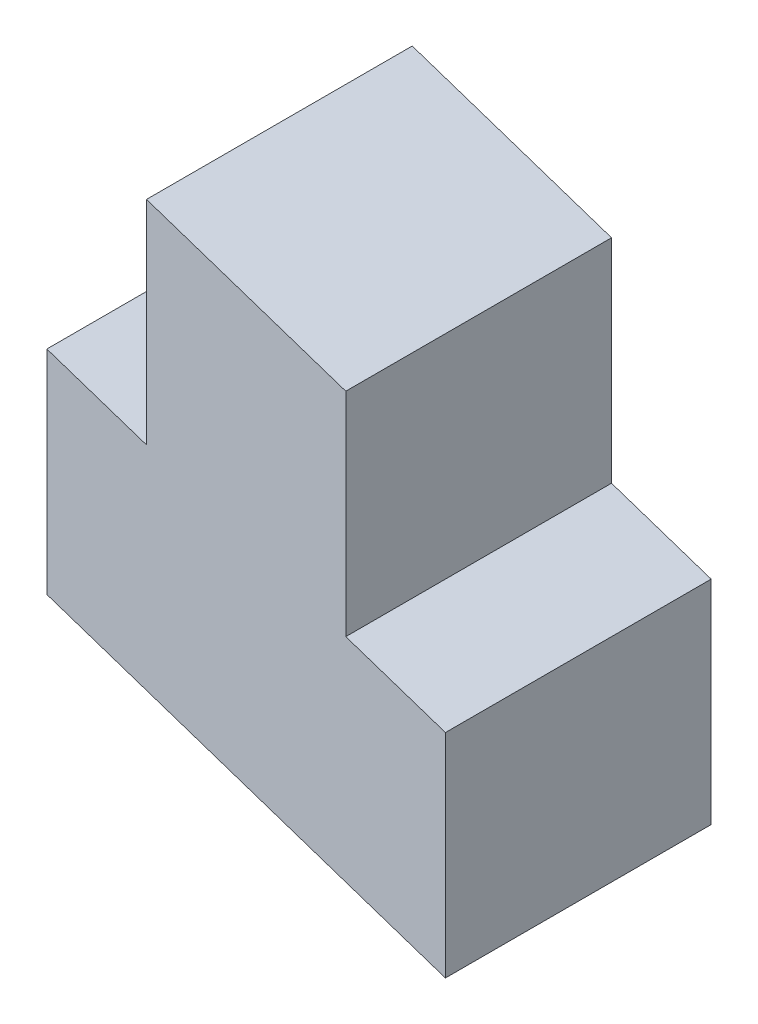
ISO-10303-21;
HEADER;
FILE_DESCRIPTION(('STEP AP214'),'2;1');
FILE_NAME('part.step','',(''),(''),'','','');
FILE_SCHEMA(('AUTOMOTIVE_DESIGN { 1 0 10303 214 1 1 1 1 }'));
ENDSEC;
DATA;
#1=APPLICATION_CONTEXT('core data for automotive mechanical design processes');
#2=APPLICATION_PROTOCOL_DEFINITION('international standard','automotive_design',2000,#1);
#3=PRODUCT_CONTEXT('',#1,'mechanical');
#4=PRODUCT('Part','Part','',(#3));
#5=PRODUCT_RELATED_PRODUCT_CATEGORY('part','',(#4));
#6=PRODUCT_DEFINITION_FORMATION('','',#4);
#7=PRODUCT_DEFINITION_CONTEXT('part definition',#1,'design');
#8=PRODUCT_DEFINITION('design','',#6,#7);
#9=PRODUCT_DEFINITION_SHAPE('','',#8);
#10=(LENGTH_UNIT() NAMED_UNIT(*) SI_UNIT(.MILLI.,.METRE.));
#11=(NAMED_UNIT(*) PLANE_ANGLE_UNIT() SI_UNIT($,.RADIAN.));
#12=(NAMED_UNIT(*) SI_UNIT($,.STERADIAN.) SOLID_ANGLE_UNIT());
#13=UNCERTAINTY_MEASURE_WITH_UNIT(LENGTH_MEASURE(1.E-05),#10,'distance_accuracy_value','');
#14=(GEOMETRIC_REPRESENTATION_CONTEXT(3) GLOBAL_UNCERTAINTY_ASSIGNED_CONTEXT((#13)) GLOBAL_UNIT_ASSIGNED_CONTEXT((#10,
#11,#12)) REPRESENTATION_CONTEXT('',''));
#15=CARTESIAN_POINT('',(0.,0.,0.));
#16=DIRECTION('',(0.,0.,1.));
#17=DIRECTION('',(1.,0.,0.));
#18=AXIS2_PLACEMENT_3D('',#15,#16,#17);
#19=CARTESIAN_POINT('',(-11.7647058823529,0.,47.0588235294118));
#20=DIRECTION('',(-0.242535625036333,0.,0.970142500145332));
#21=DIRECTION('',(0.970142500145332,0.,0.242535625036333));
#22=AXIS2_PLACEMENT_3D('',#19,#20,#21);
#23=PLANE('',#22);
#24=DIRECTION('',(0.,-1.,0.));
#25=VECTOR('',#24,1.);
#26=CARTESIAN_POINT('',(0.,40.,50.));
#27=LINE('',#26,#25);
#28=CARTESIAN_POINT('',(0.,40.,50.));
#29=VERTEX_POINT('',#28);
#30=CARTESIAN_POINT('',(0.,0.,50.));
#31=VERTEX_POINT('',#30);
#32=EDGE_CURVE('E459',#29,#31,#27,.T.);
#33=ORIENTED_EDGE('',*,*,#32,.T.);
#34=DIRECTION('',(0.970142500145332,0.,0.242535625036333));
#35=VECTOR('',#34,1.);
#36=CARTESIAN_POINT('',(0.,0.,50.));
#37=LINE('',#36,#35);
#38=CARTESIAN_POINT('',(100.,0.,75.));
#39=VERTEX_POINT('',#38);
#40=EDGE_CURVE('E164',#31,#39,#37,.T.);
#41=ORIENTED_EDGE('',*,*,#40,.T.);
#42=DIRECTION('',(0.,1.,0.));
#43=VECTOR('',#42,1.);
#44=CARTESIAN_POINT('',(100.,0.,75.));
#45=LINE('',#44,#43);
#46=CARTESIAN_POINT('',(100.,40.,75.));
#47=VERTEX_POINT('',#46);
#48=EDGE_CURVE('E442',#39,#47,#45,.T.);
#49=ORIENTED_EDGE('',*,*,#48,.T.);
#50=DIRECTION('',(-0.970142500145332,0.,-0.242535625036333));
#51=VECTOR('',#50,1.);
#52=CARTESIAN_POINT('',(100.,40.,75.));
#53=LINE('',#52,#51);
#54=CARTESIAN_POINT('',(75.,40.,68.75));
#55=VERTEX_POINT('',#54);
#56=EDGE_CURVE('E432',#47,#55,#53,.T.);
#57=ORIENTED_EDGE('',*,*,#56,.T.);
#58=DIRECTION('',(0.,1.,0.));
#59=VECTOR('',#58,1.);
#60=CARTESIAN_POINT('',(75.,40.,68.75));
#61=LINE('',#60,#59);
#62=CARTESIAN_POINT('',(75.,80.,68.75));
#63=VERTEX_POINT('',#62);
#64=EDGE_CURVE('E423',#55,#63,#61,.T.);
#65=ORIENTED_EDGE('',*,*,#64,.T.);
#66=DIRECTION('',(-0.970142500145332,0.,-0.242535625036333));
#67=VECTOR('',#66,1.);
#68=CARTESIAN_POINT('',(75.,80.,68.75));
#69=LINE('',#68,#67);
#70=CARTESIAN_POINT('',(25.,80.,56.25));
#71=VERTEX_POINT('',#70);
#72=EDGE_CURVE('E412',#63,#71,#69,.T.);
#73=ORIENTED_EDGE('',*,*,#72,.T.);
#74=DIRECTION('',(0.,-1.,0.));
#75=VECTOR('',#74,1.);
#76=CARTESIAN_POINT('',(25.,80.,56.25));
#77=LINE('',#76,#75);
#78=CARTESIAN_POINT('',(25.,40.,56.25));
#79=VERTEX_POINT('',#78);
#80=EDGE_CURVE('E71',#71,#79,#77,.T.);
#81=ORIENTED_EDGE('',*,*,#80,.T.);
#82=DIRECTION('',(-0.970142500145332,0.,-0.242535625036333));
#83=VECTOR('',#82,1.);
#84=CARTESIAN_POINT('',(25.,40.,56.25));
#85=LINE('',#84,#83);
#86=EDGE_CURVE('E12',#79,#29,#85,.T.);
#87=ORIENTED_EDGE('',*,*,#86,.T.);
#88=EDGE_LOOP('',(#33,#41,#49,#57,#65,#73,#81,#87));
#89=FACE_BOUND('',#88,.T.);
#90=ADVANCED_FACE('F61',(#89),#23,.T.);
#91=CARTESIAN_POINT('',(0.,0.,0.));
#92=DIRECTION('',(-0.242535625036333,0.,0.970142500145332));
#93=DIRECTION('',(0.970142500145332,0.,0.242535625036333));
#94=AXIS2_PLACEMENT_3D('',#91,#92,#93);
#95=PLANE('',#94);
#96=DIRECTION('',(0.,-1.,0.));
#97=VECTOR('',#96,1.);
#98=CARTESIAN_POINT('',(0.,40.,0.));
#99=LINE('',#98,#97);
#100=CARTESIAN_POINT('',(0.,40.,0.));
#101=VERTEX_POINT('',#100);
#102=CARTESIAN_POINT('',(0.,0.,0.));
#103=VERTEX_POINT('',#102);
#104=EDGE_CURVE('E135',#101,#103,#99,.T.);
#105=ORIENTED_EDGE('',*,*,#104,.F.);
#106=DIRECTION('',(-0.970142500145332,0.,-0.242535625036333));
#107=VECTOR('',#106,1.);
#108=CARTESIAN_POINT('',(25.,40.,6.25));
#109=LINE('',#108,#107);
#110=CARTESIAN_POINT('',(25.,40.,6.25));
#111=VERTEX_POINT('',#110);
#112=EDGE_CURVE('E367',#111,#101,#109,.T.);
#113=ORIENTED_EDGE('',*,*,#112,.F.);
#114=DIRECTION('',(0.,-1.,0.));
#115=VECTOR('',#114,1.);
#116=CARTESIAN_POINT('',(25.,80.,6.25));
#117=LINE('',#116,#115);
#118=CARTESIAN_POINT('',(25.,80.,6.25));
#119=VERTEX_POINT('',#118);
#120=EDGE_CURVE('E316',#119,#111,#117,.T.);
#121=ORIENTED_EDGE('',*,*,#120,.F.);
#122=DIRECTION('',(-0.970142500145332,0.,-0.242535625036333));
#123=VECTOR('',#122,1.);
#124=CARTESIAN_POINT('',(75.,80.,18.75));
#125=LINE('',#124,#123);
#126=CARTESIAN_POINT('',(75.,80.,18.75));
#127=VERTEX_POINT('',#126);
#128=EDGE_CURVE('E305',#127,#119,#125,.T.);
#129=ORIENTED_EDGE('',*,*,#128,.F.);
#130=DIRECTION('',(0.,1.,0.));
#131=VECTOR('',#130,1.);
#132=CARTESIAN_POINT('',(75.,40.,18.75));
#133=LINE('',#132,#131);
#134=CARTESIAN_POINT('',(75.,40.,18.75));
#135=VERTEX_POINT('',#134);
#136=EDGE_CURVE('E610',#135,#127,#133,.T.);
#137=ORIENTED_EDGE('',*,*,#136,.F.);
#138=DIRECTION('',(-0.970142500145332,0.,-0.242535625036333));
#139=VECTOR('',#138,1.);
#140=CARTESIAN_POINT('',(100.,40.,25.));
#141=LINE('',#140,#139);
#142=CARTESIAN_POINT('',(100.,40.,25.));
#143=VERTEX_POINT('',#142);
#144=EDGE_CURVE('E612',#143,#135,#141,.T.);
#145=ORIENTED_EDGE('',*,*,#144,.F.);
#146=DIRECTION('',(0.,1.,0.));
#147=VECTOR('',#146,1.);
#148=CARTESIAN_POINT('',(100.,0.,25.));
#149=LINE('',#148,#147);
#150=CARTESIAN_POINT('',(100.,0.,25.));
#151=VERTEX_POINT('',#150);
#152=EDGE_CURVE('E138',#151,#143,#149,.T.);
#153=ORIENTED_EDGE('',*,*,#152,.F.);
#154=DIRECTION('',(0.970142500145332,0.,0.242535625036333));
#155=VECTOR('',#154,1.);
#156=CARTESIAN_POINT('',(0.,0.,0.));
#157=LINE('',#156,#155);
#158=EDGE_CURVE('E131',#103,#151,#157,.T.);
#159=ORIENTED_EDGE('',*,*,#158,.F.);
#160=EDGE_LOOP('',(#105,#113,#121,#129,#137,#145,#153,#159));
#161=FACE_BOUND('',#160,.T.);
#162=ADVANCED_FACE('F134',(#161),#95,.F.);
#163=CARTESIAN_POINT('',(0.,0.,0.));
#164=DIRECTION('',(0.,1.,0.));
#165=DIRECTION('',(0.,0.,1.));
#166=AXIS2_PLACEMENT_3D('',#163,#164,#165);
#167=PLANE('',#166);
#168=CARTESIAN_POINT('',(100.,0.,25.));
#169=DIRECTION('',(0.,0.,1.));
#170=VECTOR('',#169,1.);
#171=LINE('',#168,#170);
#172=EDGE_CURVE('E167',#151,#39,#171,.T.);
#173=ORIENTED_EDGE('',*,*,#172,.T.);
#174=ORIENTED_EDGE('',*,*,#40,.F.);
#175=CARTESIAN_POINT('',(0.,0.,0.));
#176=DIRECTION('',(0.,0.,1.));
#177=VECTOR('',#176,1.);
#178=LINE('',#175,#177);
#179=EDGE_CURVE('E152',#103,#31,#178,.T.);
#180=ORIENTED_EDGE('',*,*,#179,.F.);
#181=ORIENTED_EDGE('',*,*,#158,.T.);
#182=EDGE_LOOP('',(#173,#174,#180,#181));
#183=FACE_BOUND('',#182,.T.);
#184=ADVANCED_FACE('F162',(#183),#167,.F.);
#185=CARTESIAN_POINT('',(0.,0.,0.));
#186=DIRECTION('',(1.,0.,0.));
#187=DIRECTION('',(0.,0.,-1.));
#188=AXIS2_PLACEMENT_3D('',#185,#186,#187);
#189=PLANE('',#188);
#190=ORIENTED_EDGE('',*,*,#179,.T.);
#191=ORIENTED_EDGE('',*,*,#32,.F.);
#192=CARTESIAN_POINT('',(0.,40.,0.));
#193=DIRECTION('',(0.,0.,1.));
#194=VECTOR('',#193,1.);
#195=LINE('',#192,#194);
#196=EDGE_CURVE('E155',#101,#29,#195,.T.);
#197=ORIENTED_EDGE('',*,*,#196,.F.);
#198=ORIENTED_EDGE('',*,*,#104,.T.);
#199=EDGE_LOOP('',(#190,#191,#197,#198));
#200=FACE_BOUND('',#199,.T.);
#201=ADVANCED_FACE('F151',(#200),#189,.F.);
#202=CARTESIAN_POINT('',(100.,0.,0.));
#203=DIRECTION('',(-1.,0.,0.));
#204=DIRECTION('',(0.,0.,1.));
#205=AXIS2_PLACEMENT_3D('',#202,#203,#204);
#206=PLANE('',#205);
#207=CARTESIAN_POINT('',(100.,40.,25.));
#208=DIRECTION('',(0.,0.,1.));
#209=VECTOR('',#208,1.);
#210=LINE('',#207,#209);
#211=EDGE_CURVE('E166',#143,#47,#210,.T.);
#212=ORIENTED_EDGE('',*,*,#211,.T.);
#213=ORIENTED_EDGE('',*,*,#48,.F.);
#214=ORIENTED_EDGE('',*,*,#172,.F.);
#215=ORIENTED_EDGE('',*,*,#152,.T.);
#216=EDGE_LOOP('',(#212,#213,#214,#215));
#217=FACE_BOUND('',#216,.T.);
#218=ADVANCED_FACE('F210',(#217),#206,.F.);
#219=CARTESIAN_POINT('',(0.,40.,0.));
#220=DIRECTION('',(0.,-1.,0.));
#221=DIRECTION('',(0.,0.,-1.));
#222=AXIS2_PLACEMENT_3D('',#219,#220,#221);
#223=PLANE('',#222);
#224=CARTESIAN_POINT('',(75.,40.,18.75));
#225=DIRECTION('',(0.,0.,1.));
#226=VECTOR('',#225,1.);
#227=LINE('',#224,#226);
#228=EDGE_CURVE('E253',#135,#55,#227,.T.);
#229=ORIENTED_EDGE('',*,*,#228,.T.);
#230=ORIENTED_EDGE('',*,*,#56,.F.);
#231=ORIENTED_EDGE('',*,*,#211,.F.);
#232=ORIENTED_EDGE('',*,*,#144,.T.);
#233=EDGE_LOOP('',(#229,#230,#231,#232));
#234=FACE_BOUND('',#233,.T.);
#235=ADVANCED_FACE('F219',(#234),#223,.F.);
#236=CARTESIAN_POINT('',(75.,0.,0.));
#237=DIRECTION('',(-1.,0.,0.));
#238=DIRECTION('',(0.,0.,1.));
#239=AXIS2_PLACEMENT_3D('',#236,#237,#238);
#240=PLANE('',#239);
#241=CARTESIAN_POINT('',(75.,80.,18.75));
#242=DIRECTION('',(0.,0.,1.));
#243=VECTOR('',#242,1.);
#244=LINE('',#241,#243);
#245=EDGE_CURVE('E593',#127,#63,#244,.T.);
#246=ORIENTED_EDGE('',*,*,#245,.T.);
#247=ORIENTED_EDGE('',*,*,#64,.F.);
#248=ORIENTED_EDGE('',*,*,#228,.F.);
#249=ORIENTED_EDGE('',*,*,#136,.T.);
#250=EDGE_LOOP('',(#246,#247,#248,#249));
#251=FACE_BOUND('',#250,.T.);
#252=ADVANCED_FACE('F271',(#251),#240,.F.);
#253=CARTESIAN_POINT('',(0.,80.,0.));
#254=DIRECTION('',(0.,-1.,0.));
#255=DIRECTION('',(0.,0.,-1.));
#256=AXIS2_PLACEMENT_3D('',#253,#254,#255);
#257=PLANE('',#256);
#258=CARTESIAN_POINT('',(25.,80.,6.25));
#259=DIRECTION('',(0.,0.,1.));
#260=VECTOR('',#259,1.);
#261=LINE('',#258,#260);
#262=EDGE_CURVE('E591',#119,#71,#261,.T.);
#263=ORIENTED_EDGE('',*,*,#262,.T.);
#264=ORIENTED_EDGE('',*,*,#72,.F.);
#265=ORIENTED_EDGE('',*,*,#245,.F.);
#266=ORIENTED_EDGE('',*,*,#128,.T.);
#267=EDGE_LOOP('',(#263,#264,#265,#266));
#268=FACE_BOUND('',#267,.T.);
#269=ADVANCED_FACE('F280',(#268),#257,.F.);
#270=CARTESIAN_POINT('',(25.,0.,0.));
#271=DIRECTION('',(1.,0.,0.));
#272=DIRECTION('',(0.,0.,-1.));
#273=AXIS2_PLACEMENT_3D('',#270,#271,#272);
#274=PLANE('',#273);
#275=CARTESIAN_POINT('',(25.,40.,6.25));
#276=DIRECTION('',(0.,0.,1.));
#277=VECTOR('',#276,1.);
#278=LINE('',#275,#277);
#279=EDGE_CURVE('E86',#111,#79,#278,.T.);
#280=ORIENTED_EDGE('',*,*,#279,.T.);
#281=ORIENTED_EDGE('',*,*,#80,.F.);
#282=ORIENTED_EDGE('',*,*,#262,.F.);
#283=ORIENTED_EDGE('',*,*,#120,.T.);
#284=EDGE_LOOP('',(#280,#281,#282,#283));
#285=FACE_BOUND('',#284,.T.);
#286=ADVANCED_FACE('F321',(#285),#274,.F.);
#287=CARTESIAN_POINT('',(0.,40.,0.));
#288=DIRECTION('',(0.,-1.,0.));
#289=DIRECTION('',(0.,0.,-1.));
#290=AXIS2_PLACEMENT_3D('',#287,#288,#289);
#291=PLANE('',#290);
#292=ORIENTED_EDGE('',*,*,#196,.T.);
#293=ORIENTED_EDGE('',*,*,#86,.F.);
#294=ORIENTED_EDGE('',*,*,#279,.F.);
#295=ORIENTED_EDGE('',*,*,#112,.T.);
#296=EDGE_LOOP('',(#292,#293,#294,#295));
#297=FACE_BOUND('',#296,.T.);
#298=ADVANCED_FACE('F329',(#297),#291,.F.);
#299=CLOSED_SHELL('',(#90,#162,#184,#201,#218,#235,#252,#269,#286,#298));
#300=MANIFOLD_SOLID_BREP('B2',#299);
#301=ADVANCED_BREP_SHAPE_REPRESENTATION('',(#18,#300),#14);
#302=SHAPE_DEFINITION_REPRESENTATION(#9,#301);
ENDSEC;
END-ISO-10303-21;
